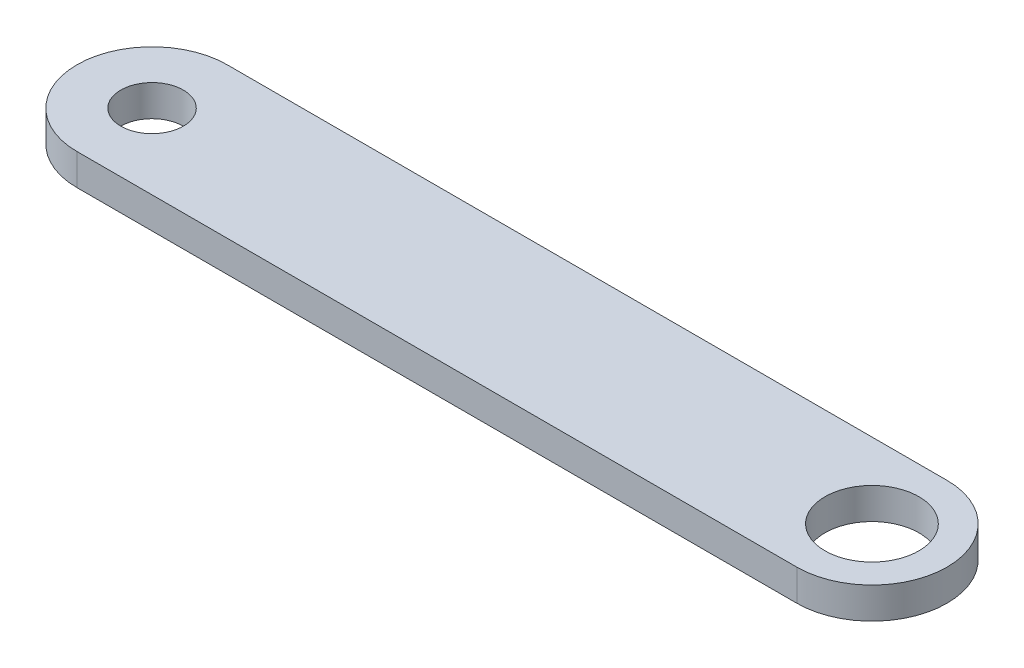
ISO-10303-21;
HEADER;
FILE_DESCRIPTION(('STEP AP214'),'2;1');
FILE_NAME('part.step','',(''),(''),'','','');
FILE_SCHEMA(('AUTOMOTIVE_DESIGN { 1 0 10303 214 1 1 1 1 }'));
ENDSEC;
DATA;
#1=APPLICATION_CONTEXT('core data for automotive mechanical design processes');
#2=APPLICATION_PROTOCOL_DEFINITION('international standard','automotive_design',2000,#1);
#3=PRODUCT_CONTEXT('',#1,'mechanical');
#4=PRODUCT('Part','Part','',(#3));
#5=PRODUCT_RELATED_PRODUCT_CATEGORY('part','',(#4));
#6=PRODUCT_DEFINITION_FORMATION('','',#4);
#7=PRODUCT_DEFINITION_CONTEXT('part definition',#1,'design');
#8=PRODUCT_DEFINITION('design','',#6,#7);
#9=PRODUCT_DEFINITION_SHAPE('','',#8);
#10=(LENGTH_UNIT() NAMED_UNIT(*) SI_UNIT(.MILLI.,.METRE.));
#11=(NAMED_UNIT(*) PLANE_ANGLE_UNIT() SI_UNIT($,.RADIAN.));
#12=(NAMED_UNIT(*) SI_UNIT($,.STERADIAN.) SOLID_ANGLE_UNIT());
#13=UNCERTAINTY_MEASURE_WITH_UNIT(LENGTH_MEASURE(1.E-05),#10,'distance_accuracy_value','');
#14=(GEOMETRIC_REPRESENTATION_CONTEXT(3) GLOBAL_UNCERTAINTY_ASSIGNED_CONTEXT((#13)) GLOBAL_UNIT_ASSIGNED_CONTEXT((#10,
#11,#12)) REPRESENTATION_CONTEXT('',''));
#15=CARTESIAN_POINT('',(0.,0.,0.));
#16=DIRECTION('',(0.,0.,1.));
#17=DIRECTION('',(1.,0.,0.));
#18=AXIS2_PLACEMENT_3D('',#15,#16,#17);
#19=CARTESIAN_POINT('',(-15.8067192356389,3.125,0.));
#20=DIRECTION('',(0.,1.,0.));
#21=DIRECTION('',(0.,0.,1.));
#22=AXIS2_PLACEMENT_3D('',#19,#20,#21);
#23=PLANE('',#22);
#24=CARTESIAN_POINT('',(-15.8067192356389,3.125,0.));
#25=DIRECTION('',(0.,1.,0.));
#26=DIRECTION('',(0.,0.,1.));
#27=AXIS2_PLACEMENT_3D('',#24,#25,#26);
#28=CIRCLE('',#27,1.25);
#29=CARTESIAN_POINT('',(-15.8067192356389,3.125,1.24999999999999));
#30=VERTEX_POINT('',#29);
#31=EDGE_CURVE('E123',#30,#30,#28,.T.);
#32=ORIENTED_EDGE('',*,*,#31,.F.);
#33=EDGE_LOOP('',(#32));
#34=FACE_BOUND('',#33,.T.);
#35=CARTESIAN_POINT('',(-15.8067192356389,3.125,0.));
#36=DIRECTION('',(0.,1.,0.));
#37=DIRECTION('',(0.,0.,1.));
#38=AXIS2_PLACEMENT_3D('',#35,#36,#37);
#39=CIRCLE('',#38,3.);
#40=CARTESIAN_POINT('',(-15.8067192356389,3.125,-3.00000000000001));
#41=VERTEX_POINT('',#40);
#42=CARTESIAN_POINT('',(-15.8067192356389,3.125,2.99999999999999));
#43=VERTEX_POINT('',#42);
#44=EDGE_CURVE('E101',#41,#43,#39,.T.);
#45=ORIENTED_EDGE('',*,*,#44,.T.);
#46=DIRECTION('',(1.,0.,0.));
#47=VECTOR('',#46,1.);
#48=CARTESIAN_POINT('',(-15.8067192356389,3.125,2.99999999999999));
#49=LINE('',#48,#47);
#50=CARTESIAN_POINT('',(12.9432807643611,3.125,2.99999999999999));
#51=VERTEX_POINT('',#50);
#52=EDGE_CURVE('E96',#43,#51,#49,.T.);
#53=ORIENTED_EDGE('',*,*,#52,.T.);
#54=CARTESIAN_POINT('',(12.9432807643611,3.125,0.));
#55=DIRECTION('',(0.,1.,0.));
#56=DIRECTION('',(0.,0.,1.));
#57=AXIS2_PLACEMENT_3D('',#54,#55,#56);
#58=CIRCLE('',#57,3.);
#59=CARTESIAN_POINT('',(12.9432807643611,3.125,-3.00000000000001));
#60=VERTEX_POINT('',#59);
#61=EDGE_CURVE('E97',#51,#60,#58,.T.);
#62=ORIENTED_EDGE('',*,*,#61,.T.);
#63=DIRECTION('',(-1.,0.,0.));
#64=VECTOR('',#63,1.);
#65=CARTESIAN_POINT('',(-15.8067192356389,3.125,-3.00000000000001));
#66=LINE('',#65,#64);
#67=EDGE_CURVE('E68',#60,#41,#66,.T.);
#68=ORIENTED_EDGE('',*,*,#67,.T.);
#69=EDGE_LOOP('',(#45,#53,#62,#68));
#70=FACE_BOUND('',#69,.T.);
#71=CARTESIAN_POINT('',(12.9432807643611,3.125,0.));
#72=DIRECTION('',(0.,1.,0.));
#73=DIRECTION('',(0.,0.,1.));
#74=AXIS2_PLACEMENT_3D('',#71,#72,#73);
#75=CIRCLE('',#74,1.875);
#76=CARTESIAN_POINT('',(12.9432807643611,3.125,1.87499999999999));
#77=VERTEX_POINT('',#76);
#78=EDGE_CURVE('E141',#77,#77,#75,.T.);
#79=ORIENTED_EDGE('',*,*,#78,.F.);
#80=EDGE_LOOP('',(#79));
#81=FACE_BOUND('',#80,.T.);
#82=ADVANCED_FACE('F48',(#34,#70,#81),#23,.T.);
#83=CARTESIAN_POINT('',(-15.8067192356389,1.875,0.));
#84=DIRECTION('',(0.,1.,0.));
#85=DIRECTION('',(0.,0.,1.));
#86=AXIS2_PLACEMENT_3D('',#83,#84,#85);
#87=PLANE('',#86);
#88=CARTESIAN_POINT('',(-15.8067192356389,1.875,0.));
#89=DIRECTION('',(0.,1.,0.));
#90=DIRECTION('',(0.,0.,1.));
#91=AXIS2_PLACEMENT_3D('',#88,#89,#90);
#92=CIRCLE('',#91,3.);
#93=CARTESIAN_POINT('',(-15.8067192356389,1.875,-3.00000000000001));
#94=VERTEX_POINT('',#93);
#95=CARTESIAN_POINT('',(-15.8067192356389,1.875,2.99999999999999));
#96=VERTEX_POINT('',#95);
#97=EDGE_CURVE('E116',#94,#96,#92,.T.);
#98=ORIENTED_EDGE('',*,*,#97,.F.);
#99=DIRECTION('',(-1.,0.,0.));
#100=VECTOR('',#99,1.);
#101=CARTESIAN_POINT('',(-15.8067192356389,1.875,-3.00000000000001));
#102=LINE('',#101,#100);
#103=CARTESIAN_POINT('',(12.9432807643611,1.875,-3.00000000000001));
#104=VERTEX_POINT('',#103);
#105=EDGE_CURVE('E90',#104,#94,#102,.T.);
#106=ORIENTED_EDGE('',*,*,#105,.F.);
#107=CARTESIAN_POINT('',(12.9432807643611,1.875,0.));
#108=DIRECTION('',(0.,1.,0.));
#109=DIRECTION('',(0.,0.,1.));
#110=AXIS2_PLACEMENT_3D('',#107,#108,#109);
#111=CIRCLE('',#110,3.);
#112=CARTESIAN_POINT('',(12.9432807643611,1.875,2.99999999999999));
#113=VERTEX_POINT('',#112);
#114=EDGE_CURVE('E82',#113,#104,#111,.T.);
#115=ORIENTED_EDGE('',*,*,#114,.F.);
#116=DIRECTION('',(1.,0.,0.));
#117=VECTOR('',#116,1.);
#118=CARTESIAN_POINT('',(-15.8067192356389,1.875,2.99999999999999));
#119=LINE('',#118,#117);
#120=EDGE_CURVE('E106',#96,#113,#119,.T.);
#121=ORIENTED_EDGE('',*,*,#120,.F.);
#122=EDGE_LOOP('',(#98,#106,#115,#121));
#123=FACE_BOUND('',#122,.T.);
#124=CARTESIAN_POINT('',(-15.8067192356389,1.875,0.));
#125=DIRECTION('',(0.,1.,0.));
#126=DIRECTION('',(0.,0.,1.));
#127=AXIS2_PLACEMENT_3D('',#124,#125,#126);
#128=CIRCLE('',#127,1.25);
#129=CARTESIAN_POINT('',(-15.8067192356389,1.875,1.24999999999999));
#130=VERTEX_POINT('',#129);
#131=EDGE_CURVE('E140',#130,#130,#128,.T.);
#132=ORIENTED_EDGE('',*,*,#131,.T.);
#133=EDGE_LOOP('',(#132));
#134=FACE_BOUND('',#133,.T.);
#135=CARTESIAN_POINT('',(12.9432807643611,1.875,0.));
#136=DIRECTION('',(0.,1.,0.));
#137=DIRECTION('',(0.,0.,1.));
#138=AXIS2_PLACEMENT_3D('',#135,#136,#137);
#139=CIRCLE('',#138,1.875);
#140=CARTESIAN_POINT('',(12.9432807643611,1.875,1.87499999999999));
#141=VERTEX_POINT('',#140);
#142=EDGE_CURVE('E150',#141,#141,#139,.T.);
#143=ORIENTED_EDGE('',*,*,#142,.T.);
#144=EDGE_LOOP('',(#143));
#145=FACE_BOUND('',#144,.T.);
#146=ADVANCED_FACE('F133',(#123,#134,#145),#87,.F.);
#147=CARTESIAN_POINT('',(-15.8067192356389,3.125,0.));
#148=DIRECTION('',(0.,-1.,0.));
#149=DIRECTION('',(0.,0.,-1.));
#150=AXIS2_PLACEMENT_3D('',#147,#148,#149);
#151=CYLINDRICAL_SURFACE('',#150,3.);
#152=ORIENTED_EDGE('',*,*,#97,.T.);
#153=DIRECTION('',(0.,-1.,0.));
#154=VECTOR('',#153,1.);
#155=CARTESIAN_POINT('',(-15.8067192356389,3.125,2.99999999999999));
#156=LINE('',#155,#154);
#157=EDGE_CURVE('E12',#43,#96,#156,.T.);
#158=ORIENTED_EDGE('',*,*,#157,.F.);
#159=ORIENTED_EDGE('',*,*,#44,.F.);
#160=DIRECTION('',(0.,-1.,0.));
#161=VECTOR('',#160,1.);
#162=CARTESIAN_POINT('',(-15.8067192356389,3.125,-3.00000000000001));
#163=LINE('',#162,#161);
#164=EDGE_CURVE('E114',#41,#94,#163,.T.);
#165=ORIENTED_EDGE('',*,*,#164,.T.);
#166=EDGE_LOOP('',(#152,#158,#159,#165));
#167=FACE_BOUND('',#166,.T.);
#168=ADVANCED_FACE('F49',(#167),#151,.T.);
#169=CARTESIAN_POINT('',(-15.8067192356389,3.125,2.99999999999999));
#170=DIRECTION('',(0.,0.,-1.));
#171=DIRECTION('',(-1.,0.,0.));
#172=AXIS2_PLACEMENT_3D('',#169,#170,#171);
#173=PLANE('',#172);
#174=ORIENTED_EDGE('',*,*,#120,.T.);
#175=DIRECTION('',(0.,-1.,0.));
#176=VECTOR('',#175,1.);
#177=CARTESIAN_POINT('',(12.9432807643611,3.125,2.99999999999999));
#178=LINE('',#177,#176);
#179=EDGE_CURVE('E59',#51,#113,#178,.T.);
#180=ORIENTED_EDGE('',*,*,#179,.F.);
#181=ORIENTED_EDGE('',*,*,#52,.F.);
#182=ORIENTED_EDGE('',*,*,#157,.T.);
#183=EDGE_LOOP('',(#174,#180,#181,#182));
#184=FACE_BOUND('',#183,.T.);
#185=ADVANCED_FACE('F104',(#184),#173,.F.);
#186=CARTESIAN_POINT('',(12.9432807643611,3.125,0.));
#187=DIRECTION('',(0.,-1.,0.));
#188=DIRECTION('',(0.,0.,-1.));
#189=AXIS2_PLACEMENT_3D('',#186,#187,#188);
#190=CYLINDRICAL_SURFACE('',#189,3.);
#191=ORIENTED_EDGE('',*,*,#114,.T.);
#192=DIRECTION('',(0.,-1.,0.));
#193=VECTOR('',#192,1.);
#194=CARTESIAN_POINT('',(12.9432807643611,3.125,-3.00000000000001));
#195=LINE('',#194,#193);
#196=EDGE_CURVE('E107',#60,#104,#195,.T.);
#197=ORIENTED_EDGE('',*,*,#196,.F.);
#198=ORIENTED_EDGE('',*,*,#61,.F.);
#199=ORIENTED_EDGE('',*,*,#179,.T.);
#200=EDGE_LOOP('',(#191,#197,#198,#199));
#201=FACE_BOUND('',#200,.T.);
#202=ADVANCED_FACE('F108',(#201),#190,.T.);
#203=CARTESIAN_POINT('',(-15.8067192356389,3.125,-3.00000000000001));
#204=DIRECTION('',(0.,0.,1.));
#205=DIRECTION('',(1.,0.,0.));
#206=AXIS2_PLACEMENT_3D('',#203,#204,#205);
#207=PLANE('',#206);
#208=ORIENTED_EDGE('',*,*,#105,.T.);
#209=ORIENTED_EDGE('',*,*,#164,.F.);
#210=ORIENTED_EDGE('',*,*,#67,.F.);
#211=ORIENTED_EDGE('',*,*,#196,.T.);
#212=EDGE_LOOP('',(#208,#209,#210,#211));
#213=FACE_BOUND('',#212,.T.);
#214=ADVANCED_FACE('F134',(#213),#207,.F.);
#215=CARTESIAN_POINT('',(-15.8067192356389,3.125,0.));
#216=DIRECTION('',(0.,-1.,0.));
#217=DIRECTION('',(0.,0.,-1.));
#218=AXIS2_PLACEMENT_3D('',#215,#216,#217);
#219=CYLINDRICAL_SURFACE('',#218,1.25);
#220=ORIENTED_EDGE('',*,*,#31,.T.);
#221=EDGE_LOOP('',(#220));
#222=FACE_BOUND('',#221,.T.);
#223=ORIENTED_EDGE('',*,*,#131,.F.);
#224=EDGE_LOOP('',(#223));
#225=FACE_BOUND('',#224,.T.);
#226=ADVANCED_FACE('F167',(#222,#225),#219,.F.);
#227=CARTESIAN_POINT('',(12.9432807643611,3.125,0.));
#228=DIRECTION('',(0.,-1.,0.));
#229=DIRECTION('',(0.,0.,-1.));
#230=AXIS2_PLACEMENT_3D('',#227,#228,#229);
#231=CYLINDRICAL_SURFACE('',#230,1.875);
#232=ORIENTED_EDGE('',*,*,#78,.T.);
#233=EDGE_LOOP('',(#232));
#234=FACE_BOUND('',#233,.T.);
#235=ORIENTED_EDGE('',*,*,#142,.F.);
#236=EDGE_LOOP('',(#235));
#237=FACE_BOUND('',#236,.T.);
#238=ADVANCED_FACE('F154',(#234,#237),#231,.F.);
#239=CLOSED_SHELL('',(#82,#146,#168,#185,#202,#214,#226,#238));
#240=MANIFOLD_SOLID_BREP('B2',#239);
#241=ADVANCED_BREP_SHAPE_REPRESENTATION('',(#18,#240),#14);
#242=SHAPE_DEFINITION_REPRESENTATION(#9,#241);
ENDSEC;
END-ISO-10303-21;
